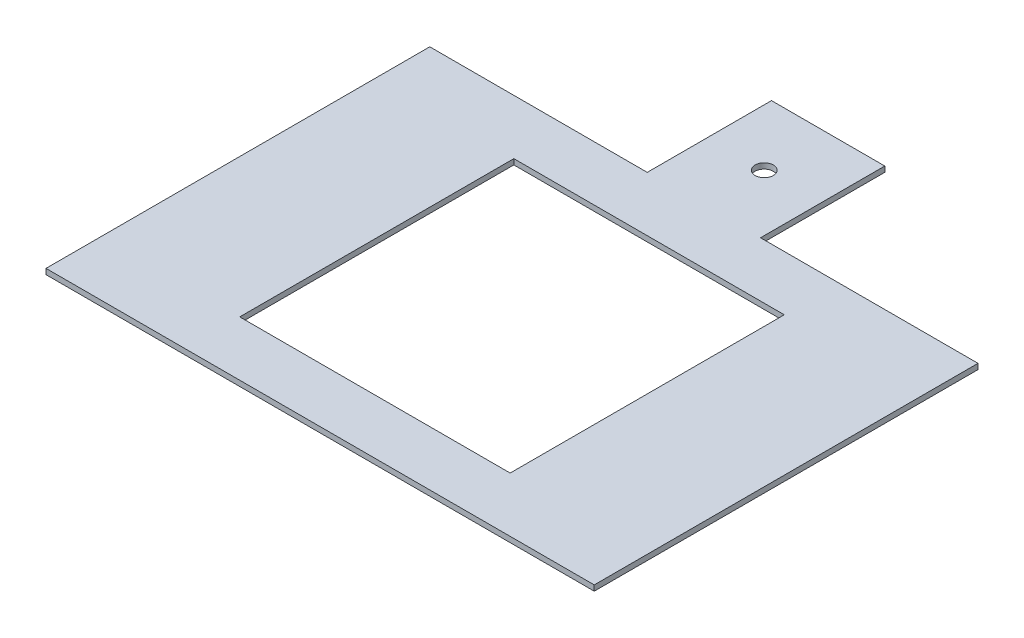
ISO-10303-21;
HEADER;
FILE_DESCRIPTION(('STEP AP214'),'2;1');
FILE_NAME('part.step','',(''),(''),'','','');
FILE_SCHEMA(('AUTOMOTIVE_DESIGN { 1 0 10303 214 1 1 1 1 }'));
ENDSEC;
DATA;
#1=APPLICATION_CONTEXT('core data for automotive mechanical design processes');
#2=APPLICATION_PROTOCOL_DEFINITION('international standard','automotive_design',2000,#1);
#3=PRODUCT_CONTEXT('',#1,'mechanical');
#4=PRODUCT('Part','Part','',(#3));
#5=PRODUCT_RELATED_PRODUCT_CATEGORY('part','',(#4));
#6=PRODUCT_DEFINITION_FORMATION('','',#4);
#7=PRODUCT_DEFINITION_CONTEXT('part definition',#1,'design');
#8=PRODUCT_DEFINITION('design','',#6,#7);
#9=PRODUCT_DEFINITION_SHAPE('','',#8);
#10=(LENGTH_UNIT() NAMED_UNIT(*) SI_UNIT(.MILLI.,.METRE.));
#11=(NAMED_UNIT(*) PLANE_ANGLE_UNIT() SI_UNIT($,.RADIAN.));
#12=(NAMED_UNIT(*) SI_UNIT($,.STERADIAN.) SOLID_ANGLE_UNIT());
#13=UNCERTAINTY_MEASURE_WITH_UNIT(LENGTH_MEASURE(1.E-05),#10,'distance_accuracy_value','');
#14=(GEOMETRIC_REPRESENTATION_CONTEXT(3) GLOBAL_UNCERTAINTY_ASSIGNED_CONTEXT((#13)) GLOBAL_UNIT_ASSIGNED_CONTEXT((#10,
#11,#12)) REPRESENTATION_CONTEXT('',''));
#15=CARTESIAN_POINT('',(0.,0.,0.));
#16=DIRECTION('',(0.,0.,1.));
#17=DIRECTION('',(1.,0.,0.));
#18=AXIS2_PLACEMENT_3D('',#15,#16,#17);
#19=CARTESIAN_POINT('',(-150.,1.5,-105.));
#20=DIRECTION('',(0.,0.,1.));
#21=DIRECTION('',(1.,0.,0.));
#22=AXIS2_PLACEMENT_3D('',#19,#20,#21);
#23=PLANE('',#22);
#24=DIRECTION('',(0.,1.,0.));
#25=VECTOR('',#24,1.);
#26=CARTESIAN_POINT('',(-31.,-1.5,-105.));
#27=LINE('',#26,#25);
#28=CARTESIAN_POINT('',(-31.,-1.5,-105.));
#29=VERTEX_POINT('',#28);
#30=CARTESIAN_POINT('',(-31.,1.5,-105.));
#31=VERTEX_POINT('',#30);
#32=EDGE_CURVE('E158',#29,#31,#27,.T.);
#33=ORIENTED_EDGE('',*,*,#32,.F.);
#34=DIRECTION('',(-1.,0.,0.));
#35=VECTOR('',#34,1.);
#36=CARTESIAN_POINT('',(-150.,-1.5,-105.));
#37=LINE('',#36,#35);
#38=CARTESIAN_POINT('',(-150.,-1.5,-105.));
#39=VERTEX_POINT('',#38);
#40=EDGE_CURVE('E205',#29,#39,#37,.T.);
#41=ORIENTED_EDGE('',*,*,#40,.T.);
#42=DIRECTION('',(0.,-1.,0.));
#43=VECTOR('',#42,1.);
#44=CARTESIAN_POINT('',(-150.,1.5,-105.));
#45=LINE('',#44,#43);
#46=CARTESIAN_POINT('',(-150.,1.5,-105.));
#47=VERTEX_POINT('',#46);
#48=EDGE_CURVE('E41',#47,#39,#45,.T.);
#49=ORIENTED_EDGE('',*,*,#48,.F.);
#50=DIRECTION('',(-1.,0.,0.));
#51=VECTOR('',#50,1.);
#52=CARTESIAN_POINT('',(-150.,1.5,-105.));
#53=LINE('',#52,#51);
#54=EDGE_CURVE('E193',#31,#47,#53,.T.);
#55=ORIENTED_EDGE('',*,*,#54,.F.);
#56=EDGE_LOOP('',(#33,#41,#49,#55));
#57=FACE_BOUND('',#56,.T.);
#58=ADVANCED_FACE('F33',(#57),#23,.F.);
#59=CARTESIAN_POINT('',(0.,1.5,0.));
#60=DIRECTION('',(0.,-1.,0.));
#61=DIRECTION('',(0.,0.,-1.));
#62=AXIS2_PLACEMENT_3D('',#59,#60,#61);
#63=PLANE('',#62);
#64=DIRECTION('',(0.,0.,-1.));
#65=VECTOR('',#64,1.);
#66=CARTESIAN_POINT('',(150.,1.5,105.));
#67=LINE('',#66,#65);
#68=CARTESIAN_POINT('',(150.,1.5,105.));
#69=VERTEX_POINT('',#68);
#70=CARTESIAN_POINT('',(150.,1.5,-105.));
#71=VERTEX_POINT('',#70);
#72=EDGE_CURVE('E190',#69,#71,#67,.T.);
#73=ORIENTED_EDGE('',*,*,#72,.T.);
#74=CARTESIAN_POINT('',(31.,1.5,-105.));
#75=VERTEX_POINT('',#74);
#76=EDGE_CURVE('E195',#71,#75,#53,.T.);
#77=ORIENTED_EDGE('',*,*,#76,.T.);
#78=DIRECTION('',(0.,0.,-1.));
#79=VECTOR('',#78,1.);
#80=CARTESIAN_POINT('',(31.,1.5,-105.));
#81=LINE('',#80,#79);
#82=CARTESIAN_POINT('',(31.,1.5,-173.));
#83=VERTEX_POINT('',#82);
#84=EDGE_CURVE('E48',#75,#83,#81,.T.);
#85=ORIENTED_EDGE('',*,*,#84,.T.);
#86=DIRECTION('',(-1.,0.,0.));
#87=VECTOR('',#86,1.);
#88=CARTESIAN_POINT('',(31.,1.5,-173.));
#89=LINE('',#88,#87);
#90=CARTESIAN_POINT('',(-31.,1.5,-173.));
#91=VERTEX_POINT('',#90);
#92=EDGE_CURVE('E127',#83,#91,#89,.T.);
#93=ORIENTED_EDGE('',*,*,#92,.T.);
#94=DIRECTION('',(0.,0.,1.));
#95=VECTOR('',#94,1.);
#96=CARTESIAN_POINT('',(-31.,1.5,-105.));
#97=LINE('',#96,#95);
#98=EDGE_CURVE('E144',#91,#31,#97,.T.);
#99=ORIENTED_EDGE('',*,*,#98,.T.);
#100=ORIENTED_EDGE('',*,*,#54,.T.);
#101=DIRECTION('',(0.,0.,1.));
#102=VECTOR('',#101,1.);
#103=CARTESIAN_POINT('',(-150.,1.5,105.));
#104=LINE('',#103,#102);
#105=CARTESIAN_POINT('',(-150.,1.5,105.));
#106=VERTEX_POINT('',#105);
#107=EDGE_CURVE('E198',#47,#106,#104,.T.);
#108=ORIENTED_EDGE('',*,*,#107,.T.);
#109=DIRECTION('',(1.,0.,0.));
#110=VECTOR('',#109,1.);
#111=CARTESIAN_POINT('',(-150.,1.5,105.));
#112=LINE('',#111,#110);
#113=EDGE_CURVE('E200',#106,#69,#112,.T.);
#114=ORIENTED_EDGE('',*,*,#113,.T.);
#115=EDGE_LOOP('',(#73,#77,#85,#93,#99,#100,#108,#114));
#116=FACE_BOUND('',#115,.T.);
#117=DIRECTION('',(0.,0.,-1.));
#118=VECTOR('',#117,1.);
#119=CARTESIAN_POINT('',(74.,1.5,75.));
#120=LINE('',#119,#118);
#121=CARTESIAN_POINT('',(74.,1.5,75.));
#122=VERTEX_POINT('',#121);
#123=CARTESIAN_POINT('',(74.,1.5,-75.));
#124=VERTEX_POINT('',#123);
#125=EDGE_CURVE('E161',#122,#124,#120,.T.);
#126=ORIENTED_EDGE('',*,*,#125,.F.);
#127=DIRECTION('',(1.,0.,0.));
#128=VECTOR('',#127,1.);
#129=CARTESIAN_POINT('',(-74.,1.5,75.));
#130=LINE('',#129,#128);
#131=CARTESIAN_POINT('',(-74.,1.5,75.));
#132=VERTEX_POINT('',#131);
#133=EDGE_CURVE('E168',#132,#122,#130,.T.);
#134=ORIENTED_EDGE('',*,*,#133,.F.);
#135=DIRECTION('',(0.,0.,1.));
#136=VECTOR('',#135,1.);
#137=CARTESIAN_POINT('',(-74.,1.5,75.));
#138=LINE('',#137,#136);
#139=CARTESIAN_POINT('',(-74.,1.5,-75.));
#140=VERTEX_POINT('',#139);
#141=EDGE_CURVE('E166',#140,#132,#138,.T.);
#142=ORIENTED_EDGE('',*,*,#141,.F.);
#143=DIRECTION('',(-1.,0.,0.));
#144=VECTOR('',#143,1.);
#145=CARTESIAN_POINT('',(-74.,1.5,-75.));
#146=LINE('',#145,#144);
#147=EDGE_CURVE('E163',#124,#140,#146,.T.);
#148=ORIENTED_EDGE('',*,*,#147,.F.);
#149=EDGE_LOOP('',(#126,#134,#142,#148));
#150=FACE_BOUND('',#149,.T.);
#151=CARTESIAN_POINT('',(0.,1.5,-138.));
#152=DIRECTION('',(0.,1.,0.));
#153=DIRECTION('',(0.,0.,1.));
#154=AXIS2_PLACEMENT_3D('',#151,#152,#153);
#155=CIRCLE('',#154,5.);
#156=CARTESIAN_POINT('',(0.,1.5,-133.));
#157=VERTEX_POINT('',#156);
#158=EDGE_CURVE('E149',#157,#157,#155,.T.);
#159=ORIENTED_EDGE('',*,*,#158,.F.);
#160=EDGE_LOOP('',(#159));
#161=FACE_BOUND('',#160,.T.);
#162=ADVANCED_FACE('F233',(#116,#150,#161),#63,.F.);
#163=CARTESIAN_POINT('',(0.,-1.5,0.));
#164=DIRECTION('',(0.,-1.,0.));
#165=DIRECTION('',(0.,0.,-1.));
#166=AXIS2_PLACEMENT_3D('',#163,#164,#165);
#167=PLANE('',#166);
#168=DIRECTION('',(0.,0.,-1.));
#169=VECTOR('',#168,1.);
#170=CARTESIAN_POINT('',(150.,-1.5,105.));
#171=LINE('',#170,#169);
#172=CARTESIAN_POINT('',(150.,-1.5,105.));
#173=VERTEX_POINT('',#172);
#174=CARTESIAN_POINT('',(150.,-1.5,-105.));
#175=VERTEX_POINT('',#174);
#176=EDGE_CURVE('E189',#173,#175,#171,.T.);
#177=ORIENTED_EDGE('',*,*,#176,.F.);
#178=DIRECTION('',(1.,0.,0.));
#179=VECTOR('',#178,1.);
#180=CARTESIAN_POINT('',(-150.,-1.5,105.));
#181=LINE('',#180,#179);
#182=CARTESIAN_POINT('',(-150.,-1.5,105.));
#183=VERTEX_POINT('',#182);
#184=EDGE_CURVE('E194',#183,#173,#181,.T.);
#185=ORIENTED_EDGE('',*,*,#184,.F.);
#186=DIRECTION('',(0.,0.,1.));
#187=VECTOR('',#186,1.);
#188=CARTESIAN_POINT('',(-150.,-1.5,105.));
#189=LINE('',#188,#187);
#190=EDGE_CURVE('E208',#39,#183,#189,.T.);
#191=ORIENTED_EDGE('',*,*,#190,.F.);
#192=ORIENTED_EDGE('',*,*,#40,.F.);
#193=DIRECTION('',(0.,0.,1.));
#194=VECTOR('',#193,1.);
#195=CARTESIAN_POINT('',(-31.,-1.5,-105.));
#196=LINE('',#195,#194);
#197=CARTESIAN_POINT('',(-31.,-1.5,-173.));
#198=VERTEX_POINT('',#197);
#199=EDGE_CURVE('E130',#198,#29,#196,.T.);
#200=ORIENTED_EDGE('',*,*,#199,.F.);
#201=DIRECTION('',(-1.,0.,0.));
#202=VECTOR('',#201,1.);
#203=CARTESIAN_POINT('',(31.,-1.5,-173.));
#204=LINE('',#203,#202);
#205=CARTESIAN_POINT('',(31.,-1.5,-173.));
#206=VERTEX_POINT('',#205);
#207=EDGE_CURVE('E125',#206,#198,#204,.T.);
#208=ORIENTED_EDGE('',*,*,#207,.F.);
#209=DIRECTION('',(0.,0.,-1.));
#210=VECTOR('',#209,1.);
#211=CARTESIAN_POINT('',(31.,-1.5,-105.));
#212=LINE('',#211,#210);
#213=CARTESIAN_POINT('',(31.,-1.5,-105.));
#214=VERTEX_POINT('',#213);
#215=EDGE_CURVE('E138',#214,#206,#212,.T.);
#216=ORIENTED_EDGE('',*,*,#215,.F.);
#217=EDGE_CURVE('E206',#175,#214,#37,.T.);
#218=ORIENTED_EDGE('',*,*,#217,.F.);
#219=EDGE_LOOP('',(#177,#185,#191,#192,#200,#208,#216,#218));
#220=FACE_BOUND('',#219,.T.);
#221=DIRECTION('',(1.,0.,0.));
#222=VECTOR('',#221,1.);
#223=CARTESIAN_POINT('',(-74.,-1.5,75.));
#224=LINE('',#223,#222);
#225=CARTESIAN_POINT('',(-74.,-1.5,75.));
#226=VERTEX_POINT('',#225);
#227=CARTESIAN_POINT('',(74.,-1.5,75.));
#228=VERTEX_POINT('',#227);
#229=EDGE_CURVE('E164',#226,#228,#224,.T.);
#230=ORIENTED_EDGE('',*,*,#229,.T.);
#231=DIRECTION('',(0.,0.,-1.));
#232=VECTOR('',#231,1.);
#233=CARTESIAN_POINT('',(74.,-1.5,75.));
#234=LINE('',#233,#232);
#235=CARTESIAN_POINT('',(74.,-1.5,-75.));
#236=VERTEX_POINT('',#235);
#237=EDGE_CURVE('E157',#228,#236,#234,.T.);
#238=ORIENTED_EDGE('',*,*,#237,.T.);
#239=DIRECTION('',(-1.,0.,0.));
#240=VECTOR('',#239,1.);
#241=CARTESIAN_POINT('',(-74.,-1.5,-75.));
#242=LINE('',#241,#240);
#243=CARTESIAN_POINT('',(-74.,-1.5,-75.));
#244=VERTEX_POINT('',#243);
#245=EDGE_CURVE('E173',#236,#244,#242,.T.);
#246=ORIENTED_EDGE('',*,*,#245,.T.);
#247=DIRECTION('',(0.,0.,1.));
#248=VECTOR('',#247,1.);
#249=CARTESIAN_POINT('',(-74.,-1.5,75.));
#250=LINE('',#249,#248);
#251=EDGE_CURVE('E176',#244,#226,#250,.T.);
#252=ORIENTED_EDGE('',*,*,#251,.T.);
#253=EDGE_LOOP('',(#230,#238,#246,#252));
#254=FACE_BOUND('',#253,.T.);
#255=CARTESIAN_POINT('',(0.,-1.5,-138.));
#256=DIRECTION('',(0.,1.,0.));
#257=DIRECTION('',(0.,0.,1.));
#258=AXIS2_PLACEMENT_3D('',#255,#256,#257);
#259=CIRCLE('',#258,5.);
#260=CARTESIAN_POINT('',(0.,-1.5,-133.));
#261=VERTEX_POINT('',#260);
#262=EDGE_CURVE('E154',#261,#261,#259,.T.);
#263=ORIENTED_EDGE('',*,*,#262,.T.);
#264=EDGE_LOOP('',(#263));
#265=FACE_BOUND('',#264,.T.);
#266=ADVANCED_FACE('F136',(#220,#254,#265),#167,.T.);
#267=CARTESIAN_POINT('',(150.,1.5,105.));
#268=DIRECTION('',(-1.,0.,0.));
#269=DIRECTION('',(0.,0.,1.));
#270=AXIS2_PLACEMENT_3D('',#267,#268,#269);
#271=PLANE('',#270);
#272=ORIENTED_EDGE('',*,*,#176,.T.);
#273=DIRECTION('',(0.,-1.,0.));
#274=VECTOR('',#273,1.);
#275=CARTESIAN_POINT('',(150.,1.5,-105.));
#276=LINE('',#275,#274);
#277=EDGE_CURVE('E11',#71,#175,#276,.T.);
#278=ORIENTED_EDGE('',*,*,#277,.F.);
#279=ORIENTED_EDGE('',*,*,#72,.F.);
#280=DIRECTION('',(0.,-1.,0.));
#281=VECTOR('',#280,1.);
#282=CARTESIAN_POINT('',(150.,1.5,105.));
#283=LINE('',#282,#281);
#284=EDGE_CURVE('E202',#69,#173,#283,.T.);
#285=ORIENTED_EDGE('',*,*,#284,.T.);
#286=EDGE_LOOP('',(#272,#278,#279,#285));
#287=FACE_BOUND('',#286,.T.);
#288=ADVANCED_FACE('F35',(#287),#271,.F.);
#289=ORIENTED_EDGE('',*,*,#217,.T.);
#290=DIRECTION('',(0.,1.,0.));
#291=VECTOR('',#290,1.);
#292=CARTESIAN_POINT('',(31.,-1.5,-105.));
#293=LINE('',#292,#291);
#294=EDGE_CURVE('E143',#214,#75,#293,.T.);
#295=ORIENTED_EDGE('',*,*,#294,.T.);
#296=ORIENTED_EDGE('',*,*,#76,.F.);
#297=ORIENTED_EDGE('',*,*,#277,.T.);
#298=EDGE_LOOP('',(#289,#295,#296,#297));
#299=FACE_BOUND('',#298,.T.);
#300=ADVANCED_FACE('F251',(#299),#23,.F.);
#301=CARTESIAN_POINT('',(-150.,1.5,105.));
#302=DIRECTION('',(1.,0.,0.));
#303=DIRECTION('',(0.,0.,-1.));
#304=AXIS2_PLACEMENT_3D('',#301,#302,#303);
#305=PLANE('',#304);
#306=ORIENTED_EDGE('',*,*,#190,.T.);
#307=DIRECTION('',(0.,-1.,0.));
#308=VECTOR('',#307,1.);
#309=CARTESIAN_POINT('',(-150.,1.5,105.));
#310=LINE('',#309,#308);
#311=EDGE_CURVE('E213',#106,#183,#310,.T.);
#312=ORIENTED_EDGE('',*,*,#311,.F.);
#313=ORIENTED_EDGE('',*,*,#107,.F.);
#314=ORIENTED_EDGE('',*,*,#48,.T.);
#315=EDGE_LOOP('',(#306,#312,#313,#314));
#316=FACE_BOUND('',#315,.T.);
#317=ADVANCED_FACE('F220',(#316),#305,.F.);
#318=CARTESIAN_POINT('',(-150.,1.5,105.));
#319=DIRECTION('',(0.,0.,-1.));
#320=DIRECTION('',(-1.,0.,0.));
#321=AXIS2_PLACEMENT_3D('',#318,#319,#320);
#322=PLANE('',#321);
#323=ORIENTED_EDGE('',*,*,#184,.T.);
#324=ORIENTED_EDGE('',*,*,#284,.F.);
#325=ORIENTED_EDGE('',*,*,#113,.F.);
#326=ORIENTED_EDGE('',*,*,#311,.T.);
#327=EDGE_LOOP('',(#323,#324,#325,#326));
#328=FACE_BOUND('',#327,.T.);
#329=ADVANCED_FACE('F227',(#328),#322,.F.);
#330=CARTESIAN_POINT('',(74.,1.5,75.));
#331=DIRECTION('',(-1.,0.,0.));
#332=DIRECTION('',(0.,0.,1.));
#333=AXIS2_PLACEMENT_3D('',#330,#331,#332);
#334=PLANE('',#333);
#335=ORIENTED_EDGE('',*,*,#237,.F.);
#336=DIRECTION('',(0.,-1.,0.));
#337=VECTOR('',#336,1.);
#338=CARTESIAN_POINT('',(74.,1.5,75.));
#339=LINE('',#338,#337);
#340=EDGE_CURVE('E170',#122,#228,#339,.T.);
#341=ORIENTED_EDGE('',*,*,#340,.F.);
#342=ORIENTED_EDGE('',*,*,#125,.T.);
#343=DIRECTION('',(0.,-1.,0.));
#344=VECTOR('',#343,1.);
#345=CARTESIAN_POINT('',(74.,1.5,-75.));
#346=LINE('',#345,#344);
#347=EDGE_CURVE('E186',#124,#236,#346,.T.);
#348=ORIENTED_EDGE('',*,*,#347,.T.);
#349=EDGE_LOOP('',(#335,#341,#342,#348));
#350=FACE_BOUND('',#349,.T.);
#351=ADVANCED_FACE('F275',(#350),#334,.T.);
#352=CARTESIAN_POINT('',(-74.,1.5,-75.));
#353=DIRECTION('',(0.,0.,1.));
#354=DIRECTION('',(1.,0.,0.));
#355=AXIS2_PLACEMENT_3D('',#352,#353,#354);
#356=PLANE('',#355);
#357=ORIENTED_EDGE('',*,*,#245,.F.);
#358=ORIENTED_EDGE('',*,*,#347,.F.);
#359=ORIENTED_EDGE('',*,*,#147,.T.);
#360=DIRECTION('',(0.,-1.,0.));
#361=VECTOR('',#360,1.);
#362=CARTESIAN_POINT('',(-74.,1.5,-75.));
#363=LINE('',#362,#361);
#364=EDGE_CURVE('E184',#140,#244,#363,.T.);
#365=ORIENTED_EDGE('',*,*,#364,.T.);
#366=EDGE_LOOP('',(#357,#358,#359,#365));
#367=FACE_BOUND('',#366,.T.);
#368=ADVANCED_FACE('F279',(#367),#356,.T.);
#369=CARTESIAN_POINT('',(-74.,1.5,75.));
#370=DIRECTION('',(1.,0.,0.));
#371=DIRECTION('',(0.,0.,-1.));
#372=AXIS2_PLACEMENT_3D('',#369,#370,#371);
#373=PLANE('',#372);
#374=ORIENTED_EDGE('',*,*,#251,.F.);
#375=ORIENTED_EDGE('',*,*,#364,.F.);
#376=ORIENTED_EDGE('',*,*,#141,.T.);
#377=DIRECTION('',(0.,-1.,0.));
#378=VECTOR('',#377,1.);
#379=CARTESIAN_POINT('',(-74.,1.5,75.));
#380=LINE('',#379,#378);
#381=EDGE_CURVE('E56',#132,#226,#380,.T.);
#382=ORIENTED_EDGE('',*,*,#381,.T.);
#383=EDGE_LOOP('',(#374,#375,#376,#382));
#384=FACE_BOUND('',#383,.T.);
#385=ADVANCED_FACE('F284',(#384),#373,.T.);
#386=CARTESIAN_POINT('',(-74.,1.5,75.));
#387=DIRECTION('',(0.,0.,-1.));
#388=DIRECTION('',(-1.,0.,0.));
#389=AXIS2_PLACEMENT_3D('',#386,#387,#388);
#390=PLANE('',#389);
#391=ORIENTED_EDGE('',*,*,#229,.F.);
#392=ORIENTED_EDGE('',*,*,#381,.F.);
#393=ORIENTED_EDGE('',*,*,#133,.T.);
#394=ORIENTED_EDGE('',*,*,#340,.T.);
#395=EDGE_LOOP('',(#391,#392,#393,#394));
#396=FACE_BOUND('',#395,.T.);
#397=ADVANCED_FACE('F247',(#396),#390,.T.);
#398=CARTESIAN_POINT('',(31.,-1.5,-105.));
#399=DIRECTION('',(1.,0.,0.));
#400=DIRECTION('',(0.,0.,-1.));
#401=AXIS2_PLACEMENT_3D('',#398,#399,#400);
#402=PLANE('',#401);
#403=ORIENTED_EDGE('',*,*,#84,.F.);
#404=ORIENTED_EDGE('',*,*,#294,.F.);
#405=ORIENTED_EDGE('',*,*,#215,.T.);
#406=DIRECTION('',(0.,1.,0.));
#407=VECTOR('',#406,1.);
#408=CARTESIAN_POINT('',(31.,-1.5,-173.));
#409=LINE('',#408,#407);
#410=EDGE_CURVE('E122',#206,#83,#409,.T.);
#411=ORIENTED_EDGE('',*,*,#410,.T.);
#412=EDGE_LOOP('',(#403,#404,#405,#411));
#413=FACE_BOUND('',#412,.T.);
#414=ADVANCED_FACE('F142',(#413),#402,.T.);
#415=CARTESIAN_POINT('',(-31.,-1.5,-105.));
#416=DIRECTION('',(-1.,0.,0.));
#417=DIRECTION('',(0.,0.,1.));
#418=AXIS2_PLACEMENT_3D('',#415,#416,#417);
#419=PLANE('',#418);
#420=ORIENTED_EDGE('',*,*,#98,.F.);
#421=DIRECTION('',(0.,1.,0.));
#422=VECTOR('',#421,1.);
#423=CARTESIAN_POINT('',(-31.,-1.5,-173.));
#424=LINE('',#423,#422);
#425=EDGE_CURVE('E129',#198,#91,#424,.T.);
#426=ORIENTED_EDGE('',*,*,#425,.F.);
#427=ORIENTED_EDGE('',*,*,#199,.T.);
#428=ORIENTED_EDGE('',*,*,#32,.T.);
#429=EDGE_LOOP('',(#420,#426,#427,#428));
#430=FACE_BOUND('',#429,.T.);
#431=ADVANCED_FACE('F238',(#430),#419,.T.);
#432=CARTESIAN_POINT('',(31.,-1.5,-173.));
#433=DIRECTION('',(0.,0.,-1.));
#434=DIRECTION('',(-1.,0.,0.));
#435=AXIS2_PLACEMENT_3D('',#432,#433,#434);
#436=PLANE('',#435);
#437=ORIENTED_EDGE('',*,*,#92,.F.);
#438=ORIENTED_EDGE('',*,*,#410,.F.);
#439=ORIENTED_EDGE('',*,*,#207,.T.);
#440=ORIENTED_EDGE('',*,*,#425,.T.);
#441=EDGE_LOOP('',(#437,#438,#439,#440));
#442=FACE_BOUND('',#441,.T.);
#443=ADVANCED_FACE('F124',(#442),#436,.T.);
#444=CARTESIAN_POINT('',(0.,-1.5,-138.));
#445=DIRECTION('',(0.,1.,0.));
#446=DIRECTION('',(0.,0.,1.));
#447=AXIS2_PLACEMENT_3D('',#444,#445,#446);
#448=CYLINDRICAL_SURFACE('',#447,5.);
#449=ORIENTED_EDGE('',*,*,#262,.F.);
#450=EDGE_LOOP('',(#449));
#451=FACE_BOUND('',#450,.T.);
#452=ORIENTED_EDGE('',*,*,#158,.T.);
#453=EDGE_LOOP('',(#452));
#454=FACE_BOUND('',#453,.T.);
#455=ADVANCED_FACE('F245',(#451,#454),#448,.F.);
#456=CLOSED_SHELL('',(#58,#162,#266,#288,#300,#317,#329,#351,#368,#385,#397,#414,#431,#443,#455));
#457=MANIFOLD_SOLID_BREP('B2',#456);
#458=ADVANCED_BREP_SHAPE_REPRESENTATION('',(#18,#457),#14);
#459=SHAPE_DEFINITION_REPRESENTATION(#9,#458);
ENDSEC;
END-ISO-10303-21;
